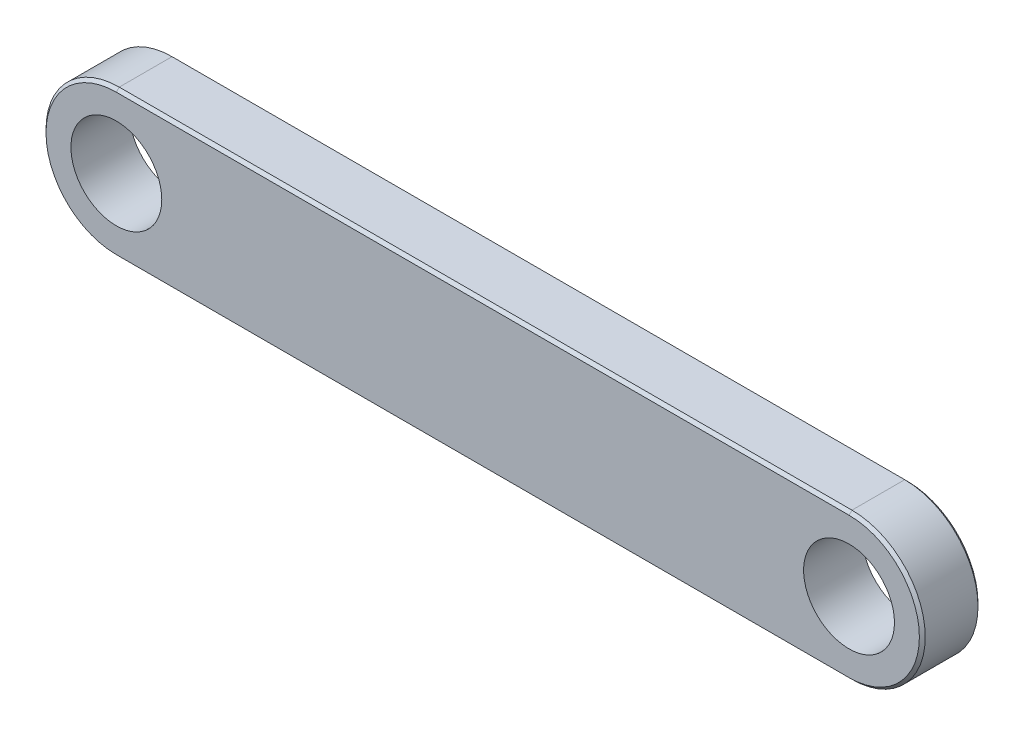
ISO-10303-21;
HEADER;
FILE_DESCRIPTION(('STEP AP214'),'2;1');
FILE_NAME('part.step','',(''),(''),'','','');
FILE_SCHEMA(('AUTOMOTIVE_DESIGN { 1 0 10303 214 1 1 1 1 }'));
ENDSEC;
DATA;
#1=APPLICATION_CONTEXT('core data for automotive mechanical design processes');
#2=APPLICATION_PROTOCOL_DEFINITION('international standard','automotive_design',2000,#1);
#3=PRODUCT_CONTEXT('',#1,'mechanical');
#4=PRODUCT('Part','Part','',(#3));
#5=PRODUCT_RELATED_PRODUCT_CATEGORY('part','',(#4));
#6=PRODUCT_DEFINITION_FORMATION('','',#4);
#7=PRODUCT_DEFINITION_CONTEXT('part definition',#1,'design');
#8=PRODUCT_DEFINITION('design','',#6,#7);
#9=PRODUCT_DEFINITION_SHAPE('','',#8);
#10=(LENGTH_UNIT() NAMED_UNIT(*) SI_UNIT(.MILLI.,.METRE.));
#11=(NAMED_UNIT(*) PLANE_ANGLE_UNIT() SI_UNIT($,.RADIAN.));
#12=(NAMED_UNIT(*) SI_UNIT($,.STERADIAN.) SOLID_ANGLE_UNIT());
#13=UNCERTAINTY_MEASURE_WITH_UNIT(LENGTH_MEASURE(1.E-05),#10,'distance_accuracy_value','');
#14=(GEOMETRIC_REPRESENTATION_CONTEXT(3) GLOBAL_UNCERTAINTY_ASSIGNED_CONTEXT((#13)) GLOBAL_UNIT_ASSIGNED_CONTEXT((#10,
#11,#12)) REPRESENTATION_CONTEXT('',''));
#15=CARTESIAN_POINT('',(0.,0.,0.));
#16=DIRECTION('',(0.,0.,1.));
#17=DIRECTION('',(1.,0.,0.));
#18=AXIS2_PLACEMENT_3D('',#15,#16,#17);
#19=CARTESIAN_POINT('',(-11.3380480905233,0.,2.));
#20=DIRECTION('',(0.,0.,1.));
#21=DIRECTION('',(1.,0.,0.));
#22=AXIS2_PLACEMENT_3D('',#19,#20,#21);
#23=PLANE('',#22);
#24=CARTESIAN_POINT('',(-11.3380480905233,0.,2.));
#25=DIRECTION('',(0.,0.,1.));
#26=DIRECTION('',(1.,0.,0.));
#27=AXIS2_PLACEMENT_3D('',#24,#25,#26);
#28=CIRCLE('',#27,2.4);
#29=CARTESIAN_POINT('',(-11.3380480905233,2.4,2.));
#30=VERTEX_POINT('',#29);
#31=CARTESIAN_POINT('',(-11.3380480905233,-2.4,2.));
#32=VERTEX_POINT('',#31);
#33=EDGE_CURVE('E60',#30,#32,#28,.T.);
#34=ORIENTED_EDGE('',*,*,#33,.T.);
#35=DIRECTION('',(1.,0.,0.));
#36=VECTOR('',#35,1.);
#37=CARTESIAN_POINT('',(13.6619519094767,-2.4,2.));
#38=LINE('',#37,#36);
#39=CARTESIAN_POINT('',(13.6619519094767,-2.4,2.));
#40=VERTEX_POINT('',#39);
#41=EDGE_CURVE('E11',#32,#40,#38,.T.);
#42=ORIENTED_EDGE('',*,*,#41,.T.);
#43=CARTESIAN_POINT('',(13.6619519094767,0.,2.));
#44=DIRECTION('',(0.,0.,1.));
#45=DIRECTION('',(1.,0.,0.));
#46=AXIS2_PLACEMENT_3D('',#43,#44,#45);
#47=CIRCLE('',#46,2.4);
#48=CARTESIAN_POINT('',(13.6619519094767,2.4,2.));
#49=VERTEX_POINT('',#48);
#50=EDGE_CURVE('E45',#40,#49,#47,.T.);
#51=ORIENTED_EDGE('',*,*,#50,.T.);
#52=DIRECTION('',(-1.,0.,0.));
#53=VECTOR('',#52,1.);
#54=CARTESIAN_POINT('',(-11.3380480905233,2.4,2.));
#55=LINE('',#54,#53);
#56=EDGE_CURVE('E200',#49,#30,#55,.T.);
#57=ORIENTED_EDGE('',*,*,#56,.T.);
#58=EDGE_LOOP('',(#34,#42,#51,#57));
#59=FACE_BOUND('',#58,.T.);
#60=CARTESIAN_POINT('',(13.6619519094767,0.,2.));
#61=DIRECTION('',(0.,0.,1.));
#62=DIRECTION('',(1.,0.,0.));
#63=AXIS2_PLACEMENT_3D('',#60,#61,#62);
#64=CIRCLE('',#63,1.55);
#65=CARTESIAN_POINT('',(15.2119519094767,0.,2.));
#66=VERTEX_POINT('',#65);
#67=EDGE_CURVE('E172',#66,#66,#64,.T.);
#68=ORIENTED_EDGE('',*,*,#67,.F.);
#69=EDGE_LOOP('',(#68));
#70=FACE_BOUND('',#69,.T.);
#71=CARTESIAN_POINT('',(-11.3380480905233,0.,2.));
#72=DIRECTION('',(0.,0.,1.));
#73=DIRECTION('',(1.,0.,0.));
#74=AXIS2_PLACEMENT_3D('',#71,#72,#73);
#75=CIRCLE('',#74,1.55);
#76=CARTESIAN_POINT('',(-9.78804809052334,0.,2.));
#77=VERTEX_POINT('',#76);
#78=EDGE_CURVE('E164',#77,#77,#75,.T.);
#79=ORIENTED_EDGE('',*,*,#78,.F.);
#80=EDGE_LOOP('',(#79));
#81=FACE_BOUND('',#80,.T.);
#82=ADVANCED_FACE('F35',(#59,#70,#81),#23,.T.);
#83=CARTESIAN_POINT('',(-11.3380480905233,0.,0.));
#84=DIRECTION('',(0.,0.,1.));
#85=DIRECTION('',(1.,0.,0.));
#86=AXIS2_PLACEMENT_3D('',#83,#84,#85);
#87=PLANE('',#86);
#88=CARTESIAN_POINT('',(13.6619519094767,0.,0.));
#89=DIRECTION('',(0.,0.,1.));
#90=DIRECTION('',(1.,0.,0.));
#91=AXIS2_PLACEMENT_3D('',#88,#89,#90);
#92=CIRCLE('',#91,2.4);
#93=CARTESIAN_POINT('',(13.6619519094767,2.4,0.));
#94=VERTEX_POINT('',#93);
#95=CARTESIAN_POINT('',(13.6619519094767,-2.4,0.));
#96=VERTEX_POINT('',#95);
#97=EDGE_CURVE('E187',#94,#96,#92,.F.);
#98=ORIENTED_EDGE('',*,*,#97,.T.);
#99=DIRECTION('',(-1.,0.,0.));
#100=VECTOR('',#99,1.);
#101=CARTESIAN_POINT('',(-11.3380480905233,-2.4,0.));
#102=LINE('',#101,#100);
#103=CARTESIAN_POINT('',(-11.3380480905233,-2.4,0.));
#104=VERTEX_POINT('',#103);
#105=EDGE_CURVE('E116',#96,#104,#102,.T.);
#106=ORIENTED_EDGE('',*,*,#105,.T.);
#107=CARTESIAN_POINT('',(-11.3380480905233,0.,0.));
#108=DIRECTION('',(0.,0.,1.));
#109=DIRECTION('',(1.,0.,0.));
#110=AXIS2_PLACEMENT_3D('',#107,#108,#109);
#111=CIRCLE('',#110,2.4);
#112=CARTESIAN_POINT('',(-11.3380480905233,2.4,0.));
#113=VERTEX_POINT('',#112);
#114=EDGE_CURVE('E185',#104,#113,#111,.F.);
#115=ORIENTED_EDGE('',*,*,#114,.T.);
#116=DIRECTION('',(1.,0.,0.));
#117=VECTOR('',#116,1.);
#118=CARTESIAN_POINT('',(-11.3380480905233,2.4,0.));
#119=LINE('',#118,#117);
#120=EDGE_CURVE('E183',#113,#94,#119,.T.);
#121=ORIENTED_EDGE('',*,*,#120,.T.);
#122=EDGE_LOOP('',(#98,#106,#115,#121));
#123=FACE_BOUND('',#122,.T.);
#124=CARTESIAN_POINT('',(13.6619519094767,0.,0.));
#125=DIRECTION('',(0.,0.,1.));
#126=DIRECTION('',(1.,0.,0.));
#127=AXIS2_PLACEMENT_3D('',#124,#125,#126);
#128=CIRCLE('',#127,1.55);
#129=CARTESIAN_POINT('',(15.2119519094767,0.,0.));
#130=VERTEX_POINT('',#129);
#131=EDGE_CURVE('E169',#130,#130,#128,.T.);
#132=ORIENTED_EDGE('',*,*,#131,.T.);
#133=EDGE_LOOP('',(#132));
#134=FACE_BOUND('',#133,.T.);
#135=CARTESIAN_POINT('',(-11.3380480905233,0.,0.));
#136=DIRECTION('',(0.,0.,1.));
#137=DIRECTION('',(1.,0.,0.));
#138=AXIS2_PLACEMENT_3D('',#135,#136,#137);
#139=CIRCLE('',#138,1.55);
#140=CARTESIAN_POINT('',(-9.78804809052334,0.,0.));
#141=VERTEX_POINT('',#140);
#142=EDGE_CURVE('E158',#141,#141,#139,.T.);
#143=ORIENTED_EDGE('',*,*,#142,.T.);
#144=EDGE_LOOP('',(#143));
#145=FACE_BOUND('',#144,.T.);
#146=ADVANCED_FACE('F230',(#123,#134,#145),#87,.F.);
#147=CARTESIAN_POINT('',(-11.3380480905233,0.,2.));
#148=DIRECTION('',(0.,0.,-1.));
#149=DIRECTION('',(-1.,0.,0.));
#150=AXIS2_PLACEMENT_3D('',#147,#148,#149);
#151=CYLINDRICAL_SURFACE('',#150,2.5);
#152=DIRECTION('',(0.,0.,-1.));
#153=VECTOR('',#152,1.);
#154=CARTESIAN_POINT('',(-11.3380480905233,2.5,2.));
#155=LINE('',#154,#153);
#156=CARTESIAN_POINT('',(-11.3380480905233,2.5,1.9));
#157=VERTEX_POINT('',#156);
#158=CARTESIAN_POINT('',(-11.3380480905233,2.5,0.0999999999999994));
#159=VERTEX_POINT('',#158);
#160=EDGE_CURVE('E175',#157,#159,#155,.T.);
#161=ORIENTED_EDGE('',*,*,#160,.T.);
#162=CARTESIAN_POINT('',(-11.3380480905233,0.,0.0999999999999994));
#163=DIRECTION('',(0.,0.,1.));
#164=DIRECTION('',(1.,0.,0.));
#165=AXIS2_PLACEMENT_3D('',#162,#163,#164);
#166=CIRCLE('',#165,2.5);
#167=CARTESIAN_POINT('',(-11.3380480905233,-2.5,0.0999999999999994));
#168=VERTEX_POINT('',#167);
#169=EDGE_CURVE('E194',#159,#168,#166,.T.);
#170=ORIENTED_EDGE('',*,*,#169,.T.);
#171=DIRECTION('',(0.,0.,-1.));
#172=VECTOR('',#171,1.);
#173=CARTESIAN_POINT('',(-11.3380480905233,-2.5,2.));
#174=LINE('',#173,#172);
#175=CARTESIAN_POINT('',(-11.3380480905233,-2.5,1.9));
#176=VERTEX_POINT('',#175);
#177=EDGE_CURVE('E127',#176,#168,#174,.T.);
#178=ORIENTED_EDGE('',*,*,#177,.F.);
#179=CARTESIAN_POINT('',(-11.3380480905233,0.,1.9));
#180=DIRECTION('',(0.,0.,1.));
#181=DIRECTION('',(1.,0.,0.));
#182=AXIS2_PLACEMENT_3D('',#179,#180,#181);
#183=CIRCLE('',#182,2.5);
#184=EDGE_CURVE('E192',#176,#157,#183,.F.);
#185=ORIENTED_EDGE('',*,*,#184,.T.);
#186=EDGE_LOOP('',(#161,#170,#178,#185));
#187=FACE_BOUND('',#186,.T.);
#188=ADVANCED_FACE('F209',(#187),#151,.T.);
#189=CARTESIAN_POINT('',(-11.3380480905233,-2.5,2.));
#190=DIRECTION('',(0.,1.,0.));
#191=DIRECTION('',(0.,0.,1.));
#192=AXIS2_PLACEMENT_3D('',#189,#190,#191);
#193=PLANE('',#192);
#194=ORIENTED_EDGE('',*,*,#177,.T.);
#195=DIRECTION('',(1.,0.,0.));
#196=VECTOR('',#195,1.);
#197=CARTESIAN_POINT('',(-11.3380480905233,-2.5,0.0999999999999994));
#198=LINE('',#197,#196);
#199=CARTESIAN_POINT('',(13.6619519094767,-2.5,0.0999999999999994));
#200=VERTEX_POINT('',#199);
#201=EDGE_CURVE('E126',#168,#200,#198,.T.);
#202=ORIENTED_EDGE('',*,*,#201,.T.);
#203=DIRECTION('',(0.,0.,-1.));
#204=VECTOR('',#203,1.);
#205=CARTESIAN_POINT('',(13.6619519094767,-2.5,2.));
#206=LINE('',#205,#204);
#207=CARTESIAN_POINT('',(13.6619519094767,-2.5,1.9));
#208=VERTEX_POINT('',#207);
#209=EDGE_CURVE('E109',#208,#200,#206,.T.);
#210=ORIENTED_EDGE('',*,*,#209,.F.);
#211=DIRECTION('',(-1.,0.,0.));
#212=VECTOR('',#211,1.);
#213=CARTESIAN_POINT('',(-11.3380480905233,-2.5,1.9));
#214=LINE('',#213,#212);
#215=EDGE_CURVE('E123',#208,#176,#214,.T.);
#216=ORIENTED_EDGE('',*,*,#215,.T.);
#217=EDGE_LOOP('',(#194,#202,#210,#216));
#218=FACE_BOUND('',#217,.T.);
#219=ADVANCED_FACE('F122',(#218),#193,.F.);
#220=CARTESIAN_POINT('',(13.6619519094767,0.,2.));
#221=DIRECTION('',(0.,0.,-1.));
#222=DIRECTION('',(-1.,0.,0.));
#223=AXIS2_PLACEMENT_3D('',#220,#221,#222);
#224=CYLINDRICAL_SURFACE('',#223,2.5);
#225=ORIENTED_EDGE('',*,*,#209,.T.);
#226=CARTESIAN_POINT('',(13.6619519094767,0.,0.0999999999999994));
#227=DIRECTION('',(0.,0.,1.));
#228=DIRECTION('',(1.,0.,0.));
#229=AXIS2_PLACEMENT_3D('',#226,#227,#228);
#230=CIRCLE('',#229,2.5);
#231=CARTESIAN_POINT('',(13.6619519094767,2.5,0.0999999999999994));
#232=VERTEX_POINT('',#231);
#233=EDGE_CURVE('E115',#200,#232,#230,.T.);
#234=ORIENTED_EDGE('',*,*,#233,.T.);
#235=DIRECTION('',(0.,0.,-1.));
#236=VECTOR('',#235,1.);
#237=CARTESIAN_POINT('',(13.6619519094767,2.5,2.));
#238=LINE('',#237,#236);
#239=CARTESIAN_POINT('',(13.6619519094767,2.5,1.9));
#240=VERTEX_POINT('',#239);
#241=EDGE_CURVE('E111',#240,#232,#238,.T.);
#242=ORIENTED_EDGE('',*,*,#241,.F.);
#243=CARTESIAN_POINT('',(13.6619519094767,0.,1.9));
#244=DIRECTION('',(0.,0.,1.));
#245=DIRECTION('',(1.,0.,0.));
#246=AXIS2_PLACEMENT_3D('',#243,#244,#245);
#247=CIRCLE('',#246,2.5);
#248=EDGE_CURVE('E106',#240,#208,#247,.F.);
#249=ORIENTED_EDGE('',*,*,#248,.T.);
#250=EDGE_LOOP('',(#225,#234,#242,#249));
#251=FACE_BOUND('',#250,.T.);
#252=ADVANCED_FACE('F108',(#251),#224,.T.);
#253=CARTESIAN_POINT('',(-11.3380480905233,2.5,2.));
#254=DIRECTION('',(0.,-1.,0.));
#255=DIRECTION('',(0.,0.,-1.));
#256=AXIS2_PLACEMENT_3D('',#253,#254,#255);
#257=PLANE('',#256);
#258=ORIENTED_EDGE('',*,*,#241,.T.);
#259=DIRECTION('',(-1.,0.,0.));
#260=VECTOR('',#259,1.);
#261=CARTESIAN_POINT('',(-11.3380480905233,2.5,0.0999999999999994));
#262=LINE('',#261,#260);
#263=EDGE_CURVE('E198',#232,#159,#262,.T.);
#264=ORIENTED_EDGE('',*,*,#263,.T.);
#265=ORIENTED_EDGE('',*,*,#160,.F.);
#266=DIRECTION('',(1.,0.,0.));
#267=VECTOR('',#266,1.);
#268=CARTESIAN_POINT('',(13.6619519094767,2.5,1.9));
#269=LINE('',#268,#267);
#270=EDGE_CURVE('E196',#157,#240,#269,.T.);
#271=ORIENTED_EDGE('',*,*,#270,.T.);
#272=EDGE_LOOP('',(#258,#264,#265,#271));
#273=FACE_BOUND('',#272,.T.);
#274=ADVANCED_FACE('F211',(#273),#257,.F.);
#275=CARTESIAN_POINT('',(13.6619519094767,0.,2.));
#276=DIRECTION('',(0.,0.,-1.));
#277=DIRECTION('',(-1.,0.,0.));
#278=AXIS2_PLACEMENT_3D('',#275,#276,#277);
#279=CYLINDRICAL_SURFACE('',#278,1.55);
#280=ORIENTED_EDGE('',*,*,#67,.T.);
#281=EDGE_LOOP('',(#280));
#282=FACE_BOUND('',#281,.T.);
#283=ORIENTED_EDGE('',*,*,#131,.F.);
#284=EDGE_LOOP('',(#283));
#285=FACE_BOUND('',#284,.T.);
#286=ADVANCED_FACE('F238',(#282,#285),#279,.F.);
#287=CARTESIAN_POINT('',(-11.3380480905233,0.,2.));
#288=DIRECTION('',(0.,0.,-1.));
#289=DIRECTION('',(-1.,0.,0.));
#290=AXIS2_PLACEMENT_3D('',#287,#288,#289);
#291=CYLINDRICAL_SURFACE('',#290,1.55);
#292=ORIENTED_EDGE('',*,*,#78,.T.);
#293=EDGE_LOOP('',(#292));
#294=FACE_BOUND('',#293,.T.);
#295=ORIENTED_EDGE('',*,*,#142,.F.);
#296=EDGE_LOOP('',(#295));
#297=FACE_BOUND('',#296,.T.);
#298=ADVANCED_FACE('F270',(#294,#297),#291,.F.);
#299=CARTESIAN_POINT('',(-11.3380480905233,2.5,0.0999999999999994));
#300=DIRECTION('',(0.,-0.707106781186548,0.707106781186548));
#301=DIRECTION('',(-1.,0.,0.));
#302=AXIS2_PLACEMENT_3D('',#299,#300,#301);
#303=PLANE('',#302);
#304=DIRECTION('',(0.,0.707106781186548,0.707106781186548));
#305=VECTOR('',#304,1.);
#306=CARTESIAN_POINT('',(13.6619519094767,2.4,0.));
#307=LINE('',#306,#305);
#308=EDGE_CURVE('E150',#94,#232,#307,.T.);
#309=ORIENTED_EDGE('',*,*,#308,.F.);
#310=ORIENTED_EDGE('',*,*,#120,.F.);
#311=DIRECTION('',(0.,-0.707106781186548,-0.707106781186548));
#312=VECTOR('',#311,1.);
#313=CARTESIAN_POINT('',(-11.3380480905233,2.5,0.0999999999999994));
#314=LINE('',#313,#312);
#315=EDGE_CURVE('E138',#159,#113,#314,.T.);
#316=ORIENTED_EDGE('',*,*,#315,.F.);
#317=ORIENTED_EDGE('',*,*,#263,.F.);
#318=EDGE_LOOP('',(#309,#310,#316,#317));
#319=FACE_BOUND('',#318,.T.);
#320=ADVANCED_FACE('F214',(#319),#303,.F.);
#321=CARTESIAN_POINT('',(-11.3380480905233,0.,0.0999999999999994));
#322=DIRECTION('',(0.,0.,1.));
#323=DIRECTION('',(1.,0.,0.));
#324=AXIS2_PLACEMENT_3D('',#321,#322,#323);
#325=CONICAL_SURFACE('',#324,2.5,0.785398163397448);
#326=ORIENTED_EDGE('',*,*,#315,.T.);
#327=ORIENTED_EDGE('',*,*,#114,.F.);
#328=DIRECTION('',(0.,0.707106781186548,-0.707106781186548));
#329=VECTOR('',#328,1.);
#330=CARTESIAN_POINT('',(-11.3380480905233,-2.5,0.0999999999999994));
#331=LINE('',#330,#329);
#332=EDGE_CURVE('E144',#168,#104,#331,.T.);
#333=ORIENTED_EDGE('',*,*,#332,.F.);
#334=ORIENTED_EDGE('',*,*,#169,.F.);
#335=EDGE_LOOP('',(#326,#327,#333,#334));
#336=FACE_BOUND('',#335,.T.);
#337=ADVANCED_FACE('F217',(#336),#325,.T.);
#338=CARTESIAN_POINT('',(13.6619519094767,0.,0.0999999999999994));
#339=DIRECTION('',(0.,0.,1.));
#340=DIRECTION('',(1.,0.,0.));
#341=AXIS2_PLACEMENT_3D('',#338,#339,#340);
#342=CONICAL_SURFACE('',#341,2.5,0.785398163397448);
#343=ORIENTED_EDGE('',*,*,#308,.T.);
#344=ORIENTED_EDGE('',*,*,#233,.F.);
#345=DIRECTION('',(0.,-0.707106781186548,0.707106781186548));
#346=VECTOR('',#345,1.);
#347=CARTESIAN_POINT('',(13.6619519094767,-2.4,0.));
#348=LINE('',#347,#346);
#349=EDGE_CURVE('E141',#96,#200,#348,.T.);
#350=ORIENTED_EDGE('',*,*,#349,.F.);
#351=ORIENTED_EDGE('',*,*,#97,.F.);
#352=EDGE_LOOP('',(#343,#344,#350,#351));
#353=FACE_BOUND('',#352,.T.);
#354=ADVANCED_FACE('F220',(#353),#342,.T.);
#355=CARTESIAN_POINT('',(-11.3380480905233,-2.5,0.0999999999999994));
#356=DIRECTION('',(0.,0.707106781186548,0.707106781186548));
#357=DIRECTION('',(1.,0.,0.));
#358=AXIS2_PLACEMENT_3D('',#355,#356,#357);
#359=PLANE('',#358);
#360=ORIENTED_EDGE('',*,*,#332,.T.);
#361=ORIENTED_EDGE('',*,*,#105,.F.);
#362=ORIENTED_EDGE('',*,*,#349,.T.);
#363=ORIENTED_EDGE('',*,*,#201,.F.);
#364=EDGE_LOOP('',(#360,#361,#362,#363));
#365=FACE_BOUND('',#364,.T.);
#366=ADVANCED_FACE('F218',(#365),#359,.F.);
#367=CARTESIAN_POINT('',(-11.3380480905233,2.4,2.));
#368=DIRECTION('',(0.,0.707106781186548,0.707106781186548));
#369=DIRECTION('',(1.,0.,0.));
#370=AXIS2_PLACEMENT_3D('',#367,#368,#369);
#371=PLANE('',#370);
#372=DIRECTION('',(0.,-0.707106781186548,0.707106781186548));
#373=VECTOR('',#372,1.);
#374=CARTESIAN_POINT('',(13.6619519094767,2.5,1.9));
#375=LINE('',#374,#373);
#376=EDGE_CURVE('E135',#240,#49,#375,.T.);
#377=ORIENTED_EDGE('',*,*,#376,.F.);
#378=ORIENTED_EDGE('',*,*,#270,.F.);
#379=DIRECTION('',(0.,0.707106781186548,-0.707106781186548));
#380=VECTOR('',#379,1.);
#381=CARTESIAN_POINT('',(-11.3380480905233,2.4,2.));
#382=LINE('',#381,#380);
#383=EDGE_CURVE('E40',#30,#157,#382,.T.);
#384=ORIENTED_EDGE('',*,*,#383,.F.);
#385=ORIENTED_EDGE('',*,*,#56,.F.);
#386=EDGE_LOOP('',(#377,#378,#384,#385));
#387=FACE_BOUND('',#386,.T.);
#388=ADVANCED_FACE('F38',(#387),#371,.T.);
#389=CARTESIAN_POINT('',(-11.3380480905233,0.,2.));
#390=DIRECTION('',(0.,0.,-1.));
#391=DIRECTION('',(-1.,0.,0.));
#392=AXIS2_PLACEMENT_3D('',#389,#390,#391);
#393=CONICAL_SURFACE('',#392,2.4,0.785398163397448);
#394=ORIENTED_EDGE('',*,*,#383,.T.);
#395=ORIENTED_EDGE('',*,*,#184,.F.);
#396=DIRECTION('',(0.,-0.707106781186548,-0.707106781186548));
#397=VECTOR('',#396,1.);
#398=CARTESIAN_POINT('',(-11.3380480905233,-2.4,2.));
#399=LINE('',#398,#397);
#400=EDGE_CURVE('E130',#32,#176,#399,.T.);
#401=ORIENTED_EDGE('',*,*,#400,.F.);
#402=ORIENTED_EDGE('',*,*,#33,.F.);
#403=EDGE_LOOP('',(#394,#395,#401,#402));
#404=FACE_BOUND('',#403,.T.);
#405=ADVANCED_FACE('F206',(#404),#393,.T.);
#406=CARTESIAN_POINT('',(13.6619519094767,0.,2.));
#407=DIRECTION('',(0.,0.,-1.));
#408=DIRECTION('',(-1.,0.,0.));
#409=AXIS2_PLACEMENT_3D('',#406,#407,#408);
#410=CONICAL_SURFACE('',#409,2.4,0.785398163397448);
#411=ORIENTED_EDGE('',*,*,#376,.T.);
#412=ORIENTED_EDGE('',*,*,#50,.F.);
#413=DIRECTION('',(0.,0.707106781186548,0.707106781186548));
#414=VECTOR('',#413,1.);
#415=CARTESIAN_POINT('',(13.6619519094767,-2.5,1.9));
#416=LINE('',#415,#414);
#417=EDGE_CURVE('E53',#208,#40,#416,.T.);
#418=ORIENTED_EDGE('',*,*,#417,.F.);
#419=ORIENTED_EDGE('',*,*,#248,.F.);
#420=EDGE_LOOP('',(#411,#412,#418,#419));
#421=FACE_BOUND('',#420,.T.);
#422=ADVANCED_FACE('F133',(#421),#410,.T.);
#423=CARTESIAN_POINT('',(-11.3380480905233,-2.4,2.));
#424=DIRECTION('',(0.,-0.707106781186548,0.707106781186548));
#425=DIRECTION('',(-1.,0.,0.));
#426=AXIS2_PLACEMENT_3D('',#423,#424,#425);
#427=PLANE('',#426);
#428=ORIENTED_EDGE('',*,*,#400,.T.);
#429=ORIENTED_EDGE('',*,*,#215,.F.);
#430=ORIENTED_EDGE('',*,*,#417,.T.);
#431=ORIENTED_EDGE('',*,*,#41,.F.);
#432=EDGE_LOOP('',(#428,#429,#430,#431));
#433=FACE_BOUND('',#432,.T.);
#434=ADVANCED_FACE('F129',(#433),#427,.T.);
#435=CLOSED_SHELL('',(#82,#146,#188,#219,#252,#274,#286,#298,#320,#337,#354,#366,#388,#405,#422,#434));
#436=MANIFOLD_SOLID_BREP('B2',#435);
#437=ADVANCED_BREP_SHAPE_REPRESENTATION('',(#18,#436),#14);
#438=SHAPE_DEFINITION_REPRESENTATION(#9,#437);
ENDSEC;
END-ISO-10303-21;
